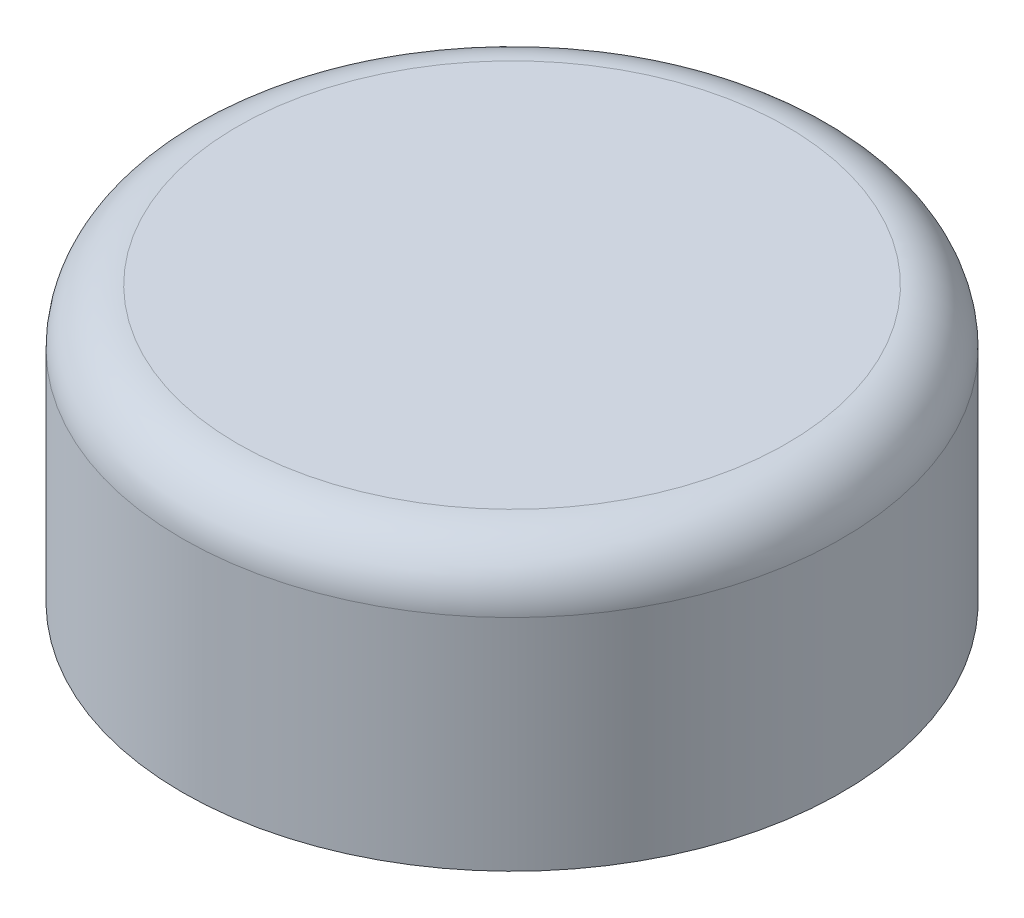
ISO-10303-21;
HEADER;
FILE_DESCRIPTION(('STEP AP214'),'2;1');
FILE_NAME('part.step','',(''),(''),'','','');
FILE_SCHEMA(('AUTOMOTIVE_DESIGN { 1 0 10303 214 1 1 1 1 }'));
ENDSEC;
DATA;
#1=APPLICATION_CONTEXT('core data for automotive mechanical design processes');
#2=APPLICATION_PROTOCOL_DEFINITION('international standard','automotive_design',2000,#1);
#3=PRODUCT_CONTEXT('',#1,'mechanical');
#4=PRODUCT('Part','Part','',(#3));
#5=PRODUCT_RELATED_PRODUCT_CATEGORY('part','',(#4));
#6=PRODUCT_DEFINITION_FORMATION('','',#4);
#7=PRODUCT_DEFINITION_CONTEXT('part definition',#1,'design');
#8=PRODUCT_DEFINITION('design','',#6,#7);
#9=PRODUCT_DEFINITION_SHAPE('','',#8);
#10=(LENGTH_UNIT() NAMED_UNIT(*) SI_UNIT(.MILLI.,.METRE.));
#11=(NAMED_UNIT(*) PLANE_ANGLE_UNIT() SI_UNIT($,.RADIAN.));
#12=(NAMED_UNIT(*) SI_UNIT($,.STERADIAN.) SOLID_ANGLE_UNIT());
#13=UNCERTAINTY_MEASURE_WITH_UNIT(LENGTH_MEASURE(1.E-05),#10,'distance_accuracy_value','');
#14=(GEOMETRIC_REPRESENTATION_CONTEXT(3) GLOBAL_UNCERTAINTY_ASSIGNED_CONTEXT((#13)) GLOBAL_UNIT_ASSIGNED_CONTEXT((#10,
#11,#12)) REPRESENTATION_CONTEXT('',''));
#15=CARTESIAN_POINT('',(0.,0.,0.));
#16=DIRECTION('',(0.,0.,1.));
#17=DIRECTION('',(1.,0.,0.));
#18=AXIS2_PLACEMENT_3D('',#15,#16,#17);
#19=CARTESIAN_POINT('',(0.,10.,0.));
#20=DIRECTION('',(0.,-1.,0.));
#21=DIRECTION('',(0.,0.,-1.));
#22=AXIS2_PLACEMENT_3D('',#19,#20,#21);
#23=CYLINDRICAL_SURFACE('',#22,12.);
#24=CARTESIAN_POINT('',(0.,8.,0.));
#25=DIRECTION('',(0.,1.,0.));
#26=DIRECTION('',(0.,0.,1.));
#27=AXIS2_PLACEMENT_3D('',#24,#25,#26);
#28=CIRCLE('',#27,12.);
#29=CARTESIAN_POINT('',(0.,8.,12.));
#30=VERTEX_POINT('',#29);
#31=EDGE_CURVE('E10',#30,#30,#28,.F.);
#32=ORIENTED_EDGE('',*,*,#31,.T.);
#33=EDGE_LOOP('',(#32));
#34=FACE_BOUND('',#33,.T.);
#35=CARTESIAN_POINT('',(0.,0.,0.));
#36=DIRECTION('',(0.,1.,0.));
#37=DIRECTION('',(0.,0.,1.));
#38=AXIS2_PLACEMENT_3D('',#35,#36,#37);
#39=CIRCLE('',#38,12.);
#40=CARTESIAN_POINT('',(0.,0.,12.));
#41=VERTEX_POINT('',#40);
#42=EDGE_CURVE('E52',#41,#41,#39,.T.);
#43=ORIENTED_EDGE('',*,*,#42,.T.);
#44=EDGE_LOOP('',(#43));
#45=FACE_BOUND('',#44,.T.);
#46=ADVANCED_FACE('F41',(#34,#45),#23,.T.);
#47=CARTESIAN_POINT('',(0.,10.,0.));
#48=DIRECTION('',(0.,1.,0.));
#49=DIRECTION('',(0.,0.,1.));
#50=AXIS2_PLACEMENT_3D('',#47,#48,#49);
#51=PLANE('',#50);
#52=CARTESIAN_POINT('',(0.,10.,0.));
#53=DIRECTION('',(0.,1.,0.));
#54=DIRECTION('',(0.,0.,1.));
#55=AXIS2_PLACEMENT_3D('',#52,#53,#54);
#56=CIRCLE('',#55,10.);
#57=CARTESIAN_POINT('',(0.,10.,10.));
#58=VERTEX_POINT('',#57);
#59=EDGE_CURVE('E48',#58,#58,#56,.T.);
#60=ORIENTED_EDGE('',*,*,#59,.T.);
#61=EDGE_LOOP('',(#60));
#62=FACE_BOUND('',#61,.T.);
#63=ADVANCED_FACE('F62',(#62),#51,.T.);
#64=CARTESIAN_POINT('',(0.,0.,0.));
#65=DIRECTION('',(0.,1.,0.));
#66=DIRECTION('',(0.,0.,1.));
#67=AXIS2_PLACEMENT_3D('',#64,#65,#66);
#68=PLANE('',#67);
#69=ORIENTED_EDGE('',*,*,#42,.F.);
#70=EDGE_LOOP('',(#69));
#71=FACE_BOUND('',#70,.T.);
#72=ADVANCED_FACE('F60',(#71),#68,.F.);
#73=CARTESIAN_POINT('',(0.,8.,0.));
#74=DIRECTION('',(0.,1.,0.));
#75=DIRECTION('',(0.,0.,1.));
#76=AXIS2_PLACEMENT_3D('',#73,#74,#75);
#77=TOROIDAL_SURFACE('',#76,10.,2.);
#78=ORIENTED_EDGE('',*,*,#31,.F.);
#79=EDGE_LOOP('',(#78));
#80=FACE_BOUND('',#79,.T.);
#81=ORIENTED_EDGE('',*,*,#59,.F.);
#82=EDGE_LOOP('',(#81));
#83=FACE_BOUND('',#82,.T.);
#84=ADVANCED_FACE('F43',(#80,#83),#77,.T.);
#85=CLOSED_SHELL('',(#46,#63,#72,#84));
#86=MANIFOLD_SOLID_BREP('B2',#85);
#87=ADVANCED_BREP_SHAPE_REPRESENTATION('',(#18,#86),#14);
#88=SHAPE_DEFINITION_REPRESENTATION(#9,#87);
ENDSEC;
END-ISO-10303-21;
